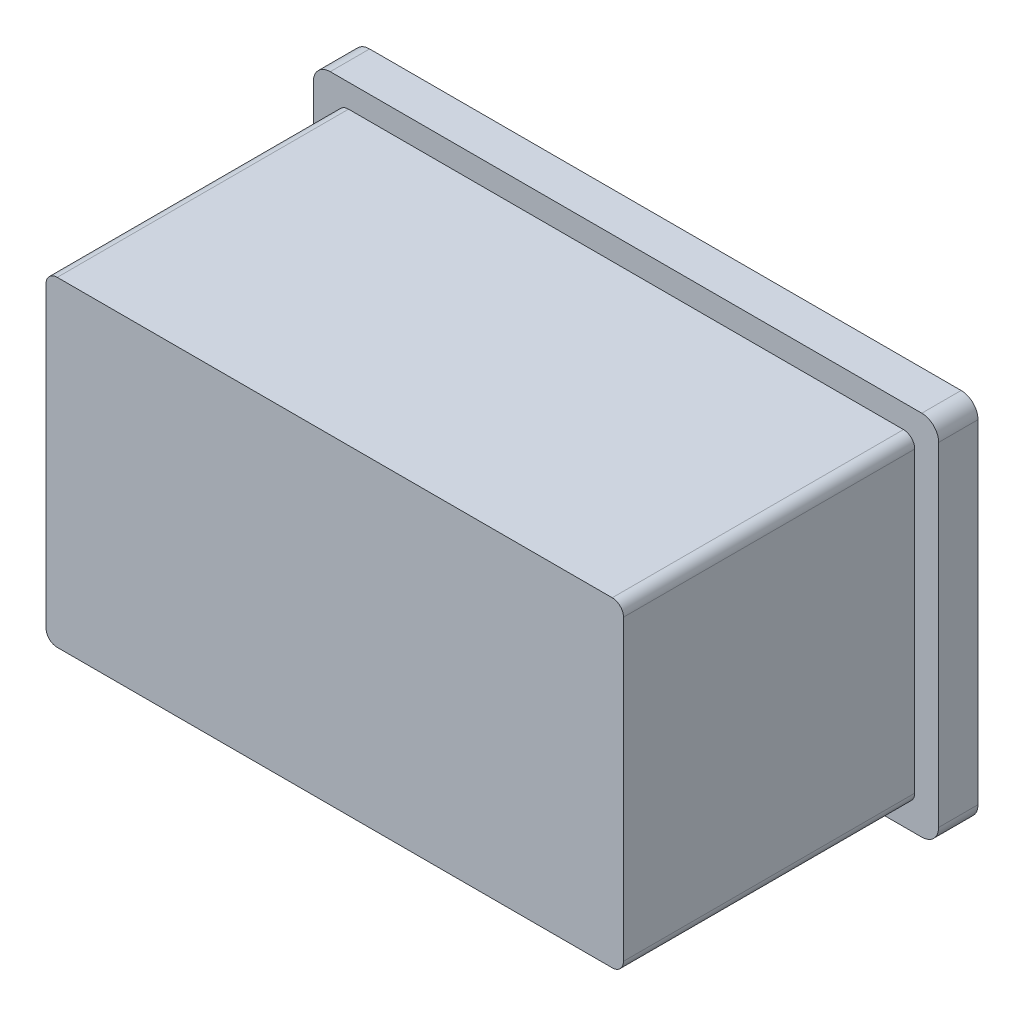
ISO-10303-21;
HEADER;
FILE_DESCRIPTION(('STEP AP214'),'2;1');
FILE_NAME('part.step','',(''),(''),'','','');
FILE_SCHEMA(('AUTOMOTIVE_DESIGN { 1 0 10303 214 1 1 1 1 }'));
ENDSEC;
DATA;
#1=APPLICATION_CONTEXT('core data for automotive mechanical design processes');
#2=APPLICATION_PROTOCOL_DEFINITION('international standard','automotive_design',2000,#1);
#3=PRODUCT_CONTEXT('',#1,'mechanical');
#4=PRODUCT('Part','Part','',(#3));
#5=PRODUCT_RELATED_PRODUCT_CATEGORY('part','',(#4));
#6=PRODUCT_DEFINITION_FORMATION('','',#4);
#7=PRODUCT_DEFINITION_CONTEXT('part definition',#1,'design');
#8=PRODUCT_DEFINITION('design','',#6,#7);
#9=PRODUCT_DEFINITION_SHAPE('','',#8);
#10=(LENGTH_UNIT() NAMED_UNIT(*) SI_UNIT(.MILLI.,.METRE.));
#11=(NAMED_UNIT(*) PLANE_ANGLE_UNIT() SI_UNIT($,.RADIAN.));
#12=(NAMED_UNIT(*) SI_UNIT($,.STERADIAN.) SOLID_ANGLE_UNIT());
#13=UNCERTAINTY_MEASURE_WITH_UNIT(LENGTH_MEASURE(1.E-05),#10,'distance_accuracy_value','');
#14=(GEOMETRIC_REPRESENTATION_CONTEXT(3) GLOBAL_UNCERTAINTY_ASSIGNED_CONTEXT((#13)) GLOBAL_UNIT_ASSIGNED_CONTEXT((#10,
#11,#12)) REPRESENTATION_CONTEXT('',''));
#15=CARTESIAN_POINT('',(0.,0.,0.));
#16=DIRECTION('',(0.,0.,1.));
#17=DIRECTION('',(1.,0.,0.));
#18=AXIS2_PLACEMENT_3D('',#15,#16,#17);
#19=CARTESIAN_POINT('',(34.15,10.15,58.8));
#20=DIRECTION('',(0.,0.,-1.));
#21=DIRECTION('',(-1.,0.,0.));
#22=AXIS2_PLACEMENT_3D('',#19,#20,#21);
#23=CYLINDRICAL_SURFACE('',#22,2.);
#24=CARTESIAN_POINT('',(34.15,10.15,7.));
#25=DIRECTION('',(0.,0.,1.));
#26=DIRECTION('',(1.,0.,0.));
#27=AXIS2_PLACEMENT_3D('',#24,#25,#26);
#28=CIRCLE('',#27,2.);
#29=CARTESIAN_POINT('',(32.15,10.15,7.));
#30=VERTEX_POINT('',#29);
#31=CARTESIAN_POINT('',(34.15,8.15,7.));
#32=VERTEX_POINT('',#31);
#33=EDGE_CURVE('E174',#30,#32,#28,.T.);
#34=ORIENTED_EDGE('',*,*,#33,.T.);
#35=DIRECTION('',(0.,0.,-1.));
#36=VECTOR('',#35,1.);
#37=CARTESIAN_POINT('',(34.15,8.15,58.8));
#38=LINE('',#37,#36);
#39=CARTESIAN_POINT('',(34.15,8.15,58.8));
#40=VERTEX_POINT('',#39);
#41=EDGE_CURVE('E11',#40,#32,#38,.T.);
#42=ORIENTED_EDGE('',*,*,#41,.F.);
#43=CARTESIAN_POINT('',(34.15,10.15,58.8));
#44=DIRECTION('',(0.,0.,1.));
#45=DIRECTION('',(1.,0.,0.));
#46=AXIS2_PLACEMENT_3D('',#43,#44,#45);
#47=CIRCLE('',#46,2.);
#48=CARTESIAN_POINT('',(32.15,10.15,58.8));
#49=VERTEX_POINT('',#48);
#50=EDGE_CURVE('E183',#49,#40,#47,.T.);
#51=ORIENTED_EDGE('',*,*,#50,.F.);
#52=DIRECTION('',(0.,0.,-1.));
#53=VECTOR('',#52,1.);
#54=CARTESIAN_POINT('',(32.15,10.15,58.8));
#55=LINE('',#54,#53);
#56=EDGE_CURVE('E198',#49,#30,#55,.T.);
#57=ORIENTED_EDGE('',*,*,#56,.T.);
#58=EDGE_LOOP('',(#34,#42,#51,#57));
#59=FACE_BOUND('',#58,.T.);
#60=ADVANCED_FACE('F41',(#59),#23,.T.);
#61=CARTESIAN_POINT('',(34.15,8.15,58.8));
#62=DIRECTION('',(0.,1.,0.));
#63=DIRECTION('',(0.,0.,1.));
#64=AXIS2_PLACEMENT_3D('',#61,#62,#63);
#65=PLANE('',#64);
#66=DIRECTION('',(1.,0.,0.));
#67=VECTOR('',#66,1.);
#68=CARTESIAN_POINT('',(34.15,8.15,7.));
#69=LINE('',#68,#67);
#70=CARTESIAN_POINT('',(132.85,8.15,7.));
#71=VERTEX_POINT('',#70);
#72=EDGE_CURVE('E178',#32,#71,#69,.T.);
#73=ORIENTED_EDGE('',*,*,#72,.T.);
#74=DIRECTION('',(0.,0.,-1.));
#75=VECTOR('',#74,1.);
#76=CARTESIAN_POINT('',(132.85,8.15,58.8));
#77=LINE('',#76,#75);
#78=CARTESIAN_POINT('',(132.85,8.15,58.8));
#79=VERTEX_POINT('',#78);
#80=EDGE_CURVE('E47',#79,#71,#77,.T.);
#81=ORIENTED_EDGE('',*,*,#80,.F.);
#82=DIRECTION('',(1.,0.,0.));
#83=VECTOR('',#82,1.);
#84=CARTESIAN_POINT('',(34.15,8.15,58.8));
#85=LINE('',#84,#83);
#86=EDGE_CURVE('E187',#40,#79,#85,.T.);
#87=ORIENTED_EDGE('',*,*,#86,.F.);
#88=ORIENTED_EDGE('',*,*,#41,.T.);
#89=EDGE_LOOP('',(#73,#81,#87,#88));
#90=FACE_BOUND('',#89,.T.);
#91=ADVANCED_FACE('F242',(#90),#65,.F.);
#92=CARTESIAN_POINT('',(132.85,10.15,58.8));
#93=DIRECTION('',(0.,0.,-1.));
#94=DIRECTION('',(-1.,0.,0.));
#95=AXIS2_PLACEMENT_3D('',#92,#93,#94);
#96=CYLINDRICAL_SURFACE('',#95,2.);
#97=CARTESIAN_POINT('',(132.85,10.15,7.));
#98=DIRECTION('',(0.,0.,1.));
#99=DIRECTION('',(1.,0.,0.));
#100=AXIS2_PLACEMENT_3D('',#97,#98,#99);
#101=CIRCLE('',#100,2.);
#102=CARTESIAN_POINT('',(134.85,10.15,7.));
#103=VERTEX_POINT('',#102);
#104=EDGE_CURVE('E201',#71,#103,#101,.T.);
#105=ORIENTED_EDGE('',*,*,#104,.T.);
#106=DIRECTION('',(0.,0.,-1.));
#107=VECTOR('',#106,1.);
#108=CARTESIAN_POINT('',(134.85,10.15,58.8));
#109=LINE('',#108,#107);
#110=CARTESIAN_POINT('',(134.85,10.15,58.8));
#111=VERTEX_POINT('',#110);
#112=EDGE_CURVE('E234',#111,#103,#109,.T.);
#113=ORIENTED_EDGE('',*,*,#112,.F.);
#114=CARTESIAN_POINT('',(132.85,10.15,58.8));
#115=DIRECTION('',(0.,0.,1.));
#116=DIRECTION('',(1.,0.,0.));
#117=AXIS2_PLACEMENT_3D('',#114,#115,#116);
#118=CIRCLE('',#117,2.);
#119=EDGE_CURVE('E186',#79,#111,#118,.T.);
#120=ORIENTED_EDGE('',*,*,#119,.F.);
#121=ORIENTED_EDGE('',*,*,#80,.T.);
#122=EDGE_LOOP('',(#105,#113,#120,#121));
#123=FACE_BOUND('',#122,.T.);
#124=ADVANCED_FACE('F239',(#123),#96,.T.);
#125=CARTESIAN_POINT('',(134.85,10.15,58.8));
#126=DIRECTION('',(-1.,0.,0.));
#127=DIRECTION('',(0.,0.,1.));
#128=AXIS2_PLACEMENT_3D('',#125,#126,#127);
#129=PLANE('',#128);
#130=DIRECTION('',(0.,1.,0.));
#131=VECTOR('',#130,1.);
#132=CARTESIAN_POINT('',(134.85,10.15,7.));
#133=LINE('',#132,#131);
#134=CARTESIAN_POINT('',(134.85,63.15,7.));
#135=VERTEX_POINT('',#134);
#136=EDGE_CURVE('E207',#103,#135,#133,.T.);
#137=ORIENTED_EDGE('',*,*,#136,.T.);
#138=DIRECTION('',(0.,0.,-1.));
#139=VECTOR('',#138,1.);
#140=CARTESIAN_POINT('',(134.85,63.15,58.8));
#141=LINE('',#140,#139);
#142=CARTESIAN_POINT('',(134.85,63.15,58.8));
#143=VERTEX_POINT('',#142);
#144=EDGE_CURVE('E233',#143,#135,#141,.T.);
#145=ORIENTED_EDGE('',*,*,#144,.F.);
#146=DIRECTION('',(0.,1.,0.));
#147=VECTOR('',#146,1.);
#148=CARTESIAN_POINT('',(134.85,10.15,58.8));
#149=LINE('',#148,#147);
#150=EDGE_CURVE('E193',#111,#143,#149,.T.);
#151=ORIENTED_EDGE('',*,*,#150,.F.);
#152=ORIENTED_EDGE('',*,*,#112,.T.);
#153=EDGE_LOOP('',(#137,#145,#151,#152));
#154=FACE_BOUND('',#153,.T.);
#155=ADVANCED_FACE('F247',(#154),#129,.F.);
#156=CARTESIAN_POINT('',(132.85,63.15,58.8));
#157=DIRECTION('',(0.,0.,-1.));
#158=DIRECTION('',(-1.,0.,0.));
#159=AXIS2_PLACEMENT_3D('',#156,#157,#158);
#160=CYLINDRICAL_SURFACE('',#159,1.99999999999999);
#161=CARTESIAN_POINT('',(132.85,63.15,7.));
#162=DIRECTION('',(0.,0.,1.));
#163=DIRECTION('',(1.,0.,0.));
#164=AXIS2_PLACEMENT_3D('',#161,#162,#163);
#165=CIRCLE('',#164,1.99999999999999);
#166=CARTESIAN_POINT('',(132.85,65.15,7.));
#167=VERTEX_POINT('',#166);
#168=EDGE_CURVE('E209',#135,#167,#165,.T.);
#169=ORIENTED_EDGE('',*,*,#168,.T.);
#170=DIRECTION('',(0.,0.,-1.));
#171=VECTOR('',#170,1.);
#172=CARTESIAN_POINT('',(132.85,65.15,58.8));
#173=LINE('',#172,#171);
#174=CARTESIAN_POINT('',(132.85,65.15,58.8));
#175=VERTEX_POINT('',#174);
#176=EDGE_CURVE('E226',#175,#167,#173,.T.);
#177=ORIENTED_EDGE('',*,*,#176,.F.);
#178=CARTESIAN_POINT('',(132.85,63.15,58.8));
#179=DIRECTION('',(0.,0.,1.));
#180=DIRECTION('',(1.,0.,0.));
#181=AXIS2_PLACEMENT_3D('',#178,#179,#180);
#182=CIRCLE('',#181,1.99999999999999);
#183=EDGE_CURVE('E192',#143,#175,#182,.T.);
#184=ORIENTED_EDGE('',*,*,#183,.F.);
#185=ORIENTED_EDGE('',*,*,#144,.T.);
#186=EDGE_LOOP('',(#169,#177,#184,#185));
#187=FACE_BOUND('',#186,.T.);
#188=ADVANCED_FACE('F255',(#187),#160,.T.);
#189=CARTESIAN_POINT('',(132.85,65.15,58.8));
#190=DIRECTION('',(0.,-1.,0.));
#191=DIRECTION('',(0.,0.,-1.));
#192=AXIS2_PLACEMENT_3D('',#189,#190,#191);
#193=PLANE('',#192);
#194=DIRECTION('',(-1.,0.,0.));
#195=VECTOR('',#194,1.);
#196=CARTESIAN_POINT('',(132.85,65.15,7.));
#197=LINE('',#196,#195);
#198=CARTESIAN_POINT('',(34.15,65.15,7.));
#199=VERTEX_POINT('',#198);
#200=EDGE_CURVE('E214',#167,#199,#197,.T.);
#201=ORIENTED_EDGE('',*,*,#200,.T.);
#202=DIRECTION('',(0.,0.,-1.));
#203=VECTOR('',#202,1.);
#204=CARTESIAN_POINT('',(34.15,65.15,58.8));
#205=LINE('',#204,#203);
#206=CARTESIAN_POINT('',(34.15,65.15,58.8));
#207=VERTEX_POINT('',#206);
#208=EDGE_CURVE('E224',#207,#199,#205,.T.);
#209=ORIENTED_EDGE('',*,*,#208,.F.);
#210=DIRECTION('',(-1.,0.,0.));
#211=VECTOR('',#210,1.);
#212=CARTESIAN_POINT('',(132.85,65.15,58.8));
#213=LINE('',#212,#211);
#214=EDGE_CURVE('E191',#175,#207,#213,.T.);
#215=ORIENTED_EDGE('',*,*,#214,.F.);
#216=ORIENTED_EDGE('',*,*,#176,.T.);
#217=EDGE_LOOP('',(#201,#209,#215,#216));
#218=FACE_BOUND('',#217,.T.);
#219=ADVANCED_FACE('F268',(#218),#193,.F.);
#220=CARTESIAN_POINT('',(34.15,63.15,58.8));
#221=DIRECTION('',(0.,0.,-1.));
#222=DIRECTION('',(-1.,0.,0.));
#223=AXIS2_PLACEMENT_3D('',#220,#221,#222);
#224=CYLINDRICAL_SURFACE('',#223,1.99999999999999);
#225=CARTESIAN_POINT('',(34.15,63.15,7.));
#226=DIRECTION('',(0.,0.,1.));
#227=DIRECTION('',(1.,0.,0.));
#228=AXIS2_PLACEMENT_3D('',#225,#226,#227);
#229=CIRCLE('',#228,1.99999999999999);
#230=CARTESIAN_POINT('',(32.15,63.15,7.));
#231=VERTEX_POINT('',#230);
#232=EDGE_CURVE('E211',#199,#231,#229,.T.);
#233=ORIENTED_EDGE('',*,*,#232,.T.);
#234=DIRECTION('',(0.,0.,-1.));
#235=VECTOR('',#234,1.);
#236=CARTESIAN_POINT('',(32.15,63.15,58.8));
#237=LINE('',#236,#235);
#238=CARTESIAN_POINT('',(32.15,63.15,58.8));
#239=VERTEX_POINT('',#238);
#240=EDGE_CURVE('E225',#239,#231,#237,.T.);
#241=ORIENTED_EDGE('',*,*,#240,.F.);
#242=CARTESIAN_POINT('',(34.15,63.15,58.8));
#243=DIRECTION('',(0.,0.,1.));
#244=DIRECTION('',(1.,0.,0.));
#245=AXIS2_PLACEMENT_3D('',#242,#243,#244);
#246=CIRCLE('',#245,1.99999999999999);
#247=EDGE_CURVE('E197',#207,#239,#246,.T.);
#248=ORIENTED_EDGE('',*,*,#247,.F.);
#249=ORIENTED_EDGE('',*,*,#208,.T.);
#250=EDGE_LOOP('',(#233,#241,#248,#249));
#251=FACE_BOUND('',#250,.T.);
#252=ADVANCED_FACE('F264',(#251),#224,.T.);
#253=CARTESIAN_POINT('',(32.15,63.15,58.8));
#254=DIRECTION('',(1.,0.,0.));
#255=DIRECTION('',(0.,0.,-1.));
#256=AXIS2_PLACEMENT_3D('',#253,#254,#255);
#257=PLANE('',#256);
#258=DIRECTION('',(0.,-1.,0.));
#259=VECTOR('',#258,1.);
#260=CARTESIAN_POINT('',(32.15,63.15,7.));
#261=LINE('',#260,#259);
#262=EDGE_CURVE('E190',#231,#30,#261,.T.);
#263=ORIENTED_EDGE('',*,*,#262,.T.);
#264=ORIENTED_EDGE('',*,*,#56,.F.);
#265=DIRECTION('',(0.,-1.,0.));
#266=VECTOR('',#265,1.);
#267=CARTESIAN_POINT('',(32.15,63.15,58.8));
#268=LINE('',#267,#266);
#269=EDGE_CURVE('E57',#239,#49,#268,.T.);
#270=ORIENTED_EDGE('',*,*,#269,.F.);
#271=ORIENTED_EDGE('',*,*,#240,.T.);
#272=EDGE_LOOP('',(#263,#264,#270,#271));
#273=FACE_BOUND('',#272,.T.);
#274=ADVANCED_FACE('F256',(#273),#257,.F.);
#275=CARTESIAN_POINT('',(34.15,10.15,58.8));
#276=DIRECTION('',(0.,0.,1.));
#277=DIRECTION('',(1.,0.,0.));
#278=AXIS2_PLACEMENT_3D('',#275,#276,#277);
#279=PLANE('',#278);
#280=ORIENTED_EDGE('',*,*,#50,.T.);
#281=ORIENTED_EDGE('',*,*,#86,.T.);
#282=ORIENTED_EDGE('',*,*,#119,.T.);
#283=ORIENTED_EDGE('',*,*,#150,.T.);
#284=ORIENTED_EDGE('',*,*,#183,.T.);
#285=ORIENTED_EDGE('',*,*,#214,.T.);
#286=ORIENTED_EDGE('',*,*,#247,.T.);
#287=ORIENTED_EDGE('',*,*,#269,.T.);
#288=EDGE_LOOP('',(#280,#281,#282,#283,#284,#285,#286,#287));
#289=FACE_BOUND('',#288,.T.);
#290=ADVANCED_FACE('F253',(#289),#279,.T.);
#291=CARTESIAN_POINT('',(30.9,7.,7.));
#292=DIRECTION('',(0.,0.,1.));
#293=DIRECTION('',(1.,0.,0.));
#294=AXIS2_PLACEMENT_3D('',#291,#292,#293);
#295=PLANE('',#294);
#296=CARTESIAN_POINT('',(30.9,7.,7.));
#297=DIRECTION('',(0.,0.,1.));
#298=DIRECTION('',(1.,0.,0.));
#299=AXIS2_PLACEMENT_3D('',#296,#297,#298);
#300=CIRCLE('',#299,3.);
#301=CARTESIAN_POINT('',(27.9,7.,7.));
#302=VERTEX_POINT('',#301);
#303=CARTESIAN_POINT('',(30.9,4.,7.));
#304=VERTEX_POINT('',#303);
#305=EDGE_CURVE('E159',#302,#304,#300,.T.);
#306=ORIENTED_EDGE('',*,*,#305,.T.);
#307=DIRECTION('',(1.,0.,0.));
#308=VECTOR('',#307,1.);
#309=CARTESIAN_POINT('',(30.9,4.,7.));
#310=LINE('',#309,#308);
#311=CARTESIAN_POINT('',(136.1,4.,7.));
#312=VERTEX_POINT('',#311);
#313=EDGE_CURVE('E150',#304,#312,#310,.T.);
#314=ORIENTED_EDGE('',*,*,#313,.T.);
#315=CARTESIAN_POINT('',(136.1,7.,7.));
#316=DIRECTION('',(0.,0.,1.));
#317=DIRECTION('',(1.,0.,0.));
#318=AXIS2_PLACEMENT_3D('',#315,#316,#317);
#319=CIRCLE('',#318,3.);
#320=CARTESIAN_POINT('',(139.1,7.,7.));
#321=VERTEX_POINT('',#320);
#322=EDGE_CURVE('E157',#312,#321,#319,.T.);
#323=ORIENTED_EDGE('',*,*,#322,.T.);
#324=DIRECTION('',(0.,1.,0.));
#325=VECTOR('',#324,1.);
#326=CARTESIAN_POINT('',(139.1,7.,7.));
#327=LINE('',#326,#325);
#328=CARTESIAN_POINT('',(139.1,66.3,7.));
#329=VERTEX_POINT('',#328);
#330=EDGE_CURVE('E456',#321,#329,#327,.T.);
#331=ORIENTED_EDGE('',*,*,#330,.T.);
#332=CARTESIAN_POINT('',(136.1,66.3,7.));
#333=DIRECTION('',(0.,0.,1.));
#334=DIRECTION('',(1.,0.,0.));
#335=AXIS2_PLACEMENT_3D('',#332,#333,#334);
#336=CIRCLE('',#335,3.);
#337=CARTESIAN_POINT('',(136.1,69.3,7.));
#338=VERTEX_POINT('',#337);
#339=EDGE_CURVE('E467',#329,#338,#336,.T.);
#340=ORIENTED_EDGE('',*,*,#339,.T.);
#341=DIRECTION('',(-1.,0.,0.));
#342=VECTOR('',#341,1.);
#343=CARTESIAN_POINT('',(136.1,69.3,7.));
#344=LINE('',#343,#342);
#345=CARTESIAN_POINT('',(30.9,69.3,7.));
#346=VERTEX_POINT('',#345);
#347=EDGE_CURVE('E461',#338,#346,#344,.T.);
#348=ORIENTED_EDGE('',*,*,#347,.T.);
#349=CARTESIAN_POINT('',(30.9,66.3,7.));
#350=DIRECTION('',(0.,0.,1.));
#351=DIRECTION('',(1.,0.,0.));
#352=AXIS2_PLACEMENT_3D('',#349,#350,#351);
#353=CIRCLE('',#352,3.);
#354=CARTESIAN_POINT('',(27.9,66.3,7.));
#355=VERTEX_POINT('',#354);
#356=EDGE_CURVE('E464',#346,#355,#353,.T.);
#357=ORIENTED_EDGE('',*,*,#356,.T.);
#358=DIRECTION('',(0.,-1.,0.));
#359=VECTOR('',#358,1.);
#360=CARTESIAN_POINT('',(27.9,66.3,7.));
#361=LINE('',#360,#359);
#362=EDGE_CURVE('E168',#355,#302,#361,.T.);
#363=ORIENTED_EDGE('',*,*,#362,.T.);
#364=EDGE_LOOP('',(#306,#314,#323,#331,#340,#348,#357,#363));
#365=FACE_BOUND('',#364,.T.);
#366=ORIENTED_EDGE('',*,*,#33,.F.);
#367=ORIENTED_EDGE('',*,*,#262,.F.);
#368=ORIENTED_EDGE('',*,*,#232,.F.);
#369=ORIENTED_EDGE('',*,*,#200,.F.);
#370=ORIENTED_EDGE('',*,*,#168,.F.);
#371=ORIENTED_EDGE('',*,*,#136,.F.);
#372=ORIENTED_EDGE('',*,*,#104,.F.);
#373=ORIENTED_EDGE('',*,*,#72,.F.);
#374=EDGE_LOOP('',(#366,#367,#368,#369,#370,#371,#372,#373));
#375=FACE_BOUND('',#374,.T.);
#376=ADVANCED_FACE('F161',(#365,#375),#295,.T.);
#377=CARTESIAN_POINT('',(30.9,7.,7.));
#378=DIRECTION('',(0.,0.,-1.));
#379=DIRECTION('',(-1.,0.,0.));
#380=AXIS2_PLACEMENT_3D('',#377,#378,#379);
#381=CYLINDRICAL_SURFACE('',#380,3.);
#382=CARTESIAN_POINT('',(30.9,7.,0.));
#383=DIRECTION('',(0.,0.,1.));
#384=DIRECTION('',(1.,0.,0.));
#385=AXIS2_PLACEMENT_3D('',#382,#383,#384);
#386=CIRCLE('',#385,3.);
#387=CARTESIAN_POINT('',(27.9,7.,0.));
#388=VERTEX_POINT('',#387);
#389=CARTESIAN_POINT('',(30.9,4.,0.));
#390=VERTEX_POINT('',#389);
#391=EDGE_CURVE('E172',#388,#390,#386,.T.);
#392=ORIENTED_EDGE('',*,*,#391,.T.);
#393=DIRECTION('',(0.,0.,-1.));
#394=VECTOR('',#393,1.);
#395=CARTESIAN_POINT('',(30.9,4.,7.));
#396=LINE('',#395,#394);
#397=EDGE_CURVE('E154',#304,#390,#396,.T.);
#398=ORIENTED_EDGE('',*,*,#397,.F.);
#399=ORIENTED_EDGE('',*,*,#305,.F.);
#400=DIRECTION('',(0.,0.,-1.));
#401=VECTOR('',#400,1.);
#402=CARTESIAN_POINT('',(27.9,7.,7.));
#403=LINE('',#402,#401);
#404=EDGE_CURVE('E438',#302,#388,#403,.T.);
#405=ORIENTED_EDGE('',*,*,#404,.T.);
#406=EDGE_LOOP('',(#392,#398,#399,#405));
#407=FACE_BOUND('',#406,.T.);
#408=ADVANCED_FACE('F175',(#407),#381,.T.);
#409=CARTESIAN_POINT('',(30.9,4.,7.));
#410=DIRECTION('',(0.,1.,0.));
#411=DIRECTION('',(0.,0.,1.));
#412=AXIS2_PLACEMENT_3D('',#409,#410,#411);
#413=PLANE('',#412);
#414=DIRECTION('',(1.,0.,0.));
#415=VECTOR('',#414,1.);
#416=CARTESIAN_POINT('',(30.9,4.,0.));
#417=LINE('',#416,#415);
#418=CARTESIAN_POINT('',(136.1,4.,0.));
#419=VERTEX_POINT('',#418);
#420=EDGE_CURVE('E423',#390,#419,#417,.T.);
#421=ORIENTED_EDGE('',*,*,#420,.T.);
#422=DIRECTION('',(0.,0.,-1.));
#423=VECTOR('',#422,1.);
#424=CARTESIAN_POINT('',(136.1,4.,7.));
#425=LINE('',#424,#423);
#426=EDGE_CURVE('E158',#312,#419,#425,.T.);
#427=ORIENTED_EDGE('',*,*,#426,.F.);
#428=ORIENTED_EDGE('',*,*,#313,.F.);
#429=ORIENTED_EDGE('',*,*,#397,.T.);
#430=EDGE_LOOP('',(#421,#427,#428,#429));
#431=FACE_BOUND('',#430,.T.);
#432=ADVANCED_FACE('F151',(#431),#413,.F.);
#433=CARTESIAN_POINT('',(136.1,7.,7.));
#434=DIRECTION('',(0.,0.,-1.));
#435=DIRECTION('',(-1.,0.,0.));
#436=AXIS2_PLACEMENT_3D('',#433,#434,#435);
#437=CYLINDRICAL_SURFACE('',#436,3.);
#438=CARTESIAN_POINT('',(136.1,7.,0.));
#439=DIRECTION('',(0.,0.,1.));
#440=DIRECTION('',(1.,0.,0.));
#441=AXIS2_PLACEMENT_3D('',#438,#439,#440);
#442=CIRCLE('',#441,3.);
#443=CARTESIAN_POINT('',(139.1,7.,0.));
#444=VERTEX_POINT('',#443);
#445=EDGE_CURVE('E421',#419,#444,#442,.T.);
#446=ORIENTED_EDGE('',*,*,#445,.T.);
#447=DIRECTION('',(0.,0.,-1.));
#448=VECTOR('',#447,1.);
#449=CARTESIAN_POINT('',(139.1,7.,7.));
#450=LINE('',#449,#448);
#451=EDGE_CURVE('E179',#321,#444,#450,.T.);
#452=ORIENTED_EDGE('',*,*,#451,.F.);
#453=ORIENTED_EDGE('',*,*,#322,.F.);
#454=ORIENTED_EDGE('',*,*,#426,.T.);
#455=EDGE_LOOP('',(#446,#452,#453,#454));
#456=FACE_BOUND('',#455,.T.);
#457=ADVANCED_FACE('F346',(#456),#437,.T.);
#458=CARTESIAN_POINT('',(139.1,7.,7.));
#459=DIRECTION('',(-1.,0.,0.));
#460=DIRECTION('',(0.,0.,1.));
#461=AXIS2_PLACEMENT_3D('',#458,#459,#460);
#462=PLANE('',#461);
#463=DIRECTION('',(0.,1.,0.));
#464=VECTOR('',#463,1.);
#465=CARTESIAN_POINT('',(139.1,7.,0.));
#466=LINE('',#465,#464);
#467=CARTESIAN_POINT('',(139.1,66.3,0.));
#468=VERTEX_POINT('',#467);
#469=EDGE_CURVE('E429',#444,#468,#466,.T.);
#470=ORIENTED_EDGE('',*,*,#469,.T.);
#471=DIRECTION('',(0.,0.,-1.));
#472=VECTOR('',#471,1.);
#473=CARTESIAN_POINT('',(139.1,66.3,7.));
#474=LINE('',#473,#472);
#475=EDGE_CURVE('E446',#329,#468,#474,.T.);
#476=ORIENTED_EDGE('',*,*,#475,.F.);
#477=ORIENTED_EDGE('',*,*,#330,.F.);
#478=ORIENTED_EDGE('',*,*,#451,.T.);
#479=EDGE_LOOP('',(#470,#476,#477,#478));
#480=FACE_BOUND('',#479,.T.);
#481=ADVANCED_FACE('F354',(#480),#462,.F.);
#482=CARTESIAN_POINT('',(136.1,66.3,7.));
#483=DIRECTION('',(0.,0.,-1.));
#484=DIRECTION('',(-1.,0.,0.));
#485=AXIS2_PLACEMENT_3D('',#482,#483,#484);
#486=CYLINDRICAL_SURFACE('',#485,3.);
#487=CARTESIAN_POINT('',(136.1,66.3,0.));
#488=DIRECTION('',(0.,0.,1.));
#489=DIRECTION('',(1.,0.,0.));
#490=AXIS2_PLACEMENT_3D('',#487,#488,#489);
#491=CIRCLE('',#490,3.);
#492=CARTESIAN_POINT('',(136.1,69.3,0.));
#493=VERTEX_POINT('',#492);
#494=EDGE_CURVE('E431',#468,#493,#491,.T.);
#495=ORIENTED_EDGE('',*,*,#494,.T.);
#496=DIRECTION('',(0.,0.,-1.));
#497=VECTOR('',#496,1.);
#498=CARTESIAN_POINT('',(136.1,69.3,7.));
#499=LINE('',#498,#497);
#500=EDGE_CURVE('E447',#338,#493,#499,.T.);
#501=ORIENTED_EDGE('',*,*,#500,.F.);
#502=ORIENTED_EDGE('',*,*,#339,.F.);
#503=ORIENTED_EDGE('',*,*,#475,.T.);
#504=EDGE_LOOP('',(#495,#501,#502,#503));
#505=FACE_BOUND('',#504,.T.);
#506=ADVANCED_FACE('F362',(#505),#486,.T.);
#507=CARTESIAN_POINT('',(136.1,69.3,7.));
#508=DIRECTION('',(0.,-1.,0.));
#509=DIRECTION('',(0.,0.,-1.));
#510=AXIS2_PLACEMENT_3D('',#507,#508,#509);
#511=PLANE('',#510);
#512=DIRECTION('',(-1.,0.,0.));
#513=VECTOR('',#512,1.);
#514=CARTESIAN_POINT('',(136.1,69.3,0.));
#515=LINE('',#514,#513);
#516=CARTESIAN_POINT('',(30.9,69.3,0.));
#517=VERTEX_POINT('',#516);
#518=EDGE_CURVE('E433',#493,#517,#515,.T.);
#519=ORIENTED_EDGE('',*,*,#518,.T.);
#520=DIRECTION('',(0.,0.,-1.));
#521=VECTOR('',#520,1.);
#522=CARTESIAN_POINT('',(30.9,69.3,7.));
#523=LINE('',#522,#521);
#524=EDGE_CURVE('E442',#346,#517,#523,.T.);
#525=ORIENTED_EDGE('',*,*,#524,.F.);
#526=ORIENTED_EDGE('',*,*,#347,.F.);
#527=ORIENTED_EDGE('',*,*,#500,.T.);
#528=EDGE_LOOP('',(#519,#525,#526,#527));
#529=FACE_BOUND('',#528,.T.);
#530=ADVANCED_FACE('F374',(#529),#511,.F.);
#531=CARTESIAN_POINT('',(30.9,66.3,7.));
#532=DIRECTION('',(0.,0.,-1.));
#533=DIRECTION('',(-1.,0.,0.));
#534=AXIS2_PLACEMENT_3D('',#531,#532,#533);
#535=CYLINDRICAL_SURFACE('',#534,3.);
#536=CARTESIAN_POINT('',(30.9,66.3,0.));
#537=DIRECTION('',(0.,0.,1.));
#538=DIRECTION('',(1.,0.,0.));
#539=AXIS2_PLACEMENT_3D('',#536,#537,#538);
#540=CIRCLE('',#539,3.);
#541=CARTESIAN_POINT('',(27.9,66.3,0.));
#542=VERTEX_POINT('',#541);
#543=EDGE_CURVE('E434',#517,#542,#540,.T.);
#544=ORIENTED_EDGE('',*,*,#543,.T.);
#545=DIRECTION('',(0.,0.,-1.));
#546=VECTOR('',#545,1.);
#547=CARTESIAN_POINT('',(27.9,66.3,7.));
#548=LINE('',#547,#546);
#549=EDGE_CURVE('E439',#355,#542,#548,.T.);
#550=ORIENTED_EDGE('',*,*,#549,.F.);
#551=ORIENTED_EDGE('',*,*,#356,.F.);
#552=ORIENTED_EDGE('',*,*,#524,.T.);
#553=EDGE_LOOP('',(#544,#550,#551,#552));
#554=FACE_BOUND('',#553,.T.);
#555=ADVANCED_FACE('F383',(#554),#535,.T.);
#556=CARTESIAN_POINT('',(27.9,66.3,7.));
#557=DIRECTION('',(1.,0.,0.));
#558=DIRECTION('',(0.,0.,-1.));
#559=AXIS2_PLACEMENT_3D('',#556,#557,#558);
#560=PLANE('',#559);
#561=DIRECTION('',(0.,-1.,0.));
#562=VECTOR('',#561,1.);
#563=CARTESIAN_POINT('',(27.9,66.3,0.));
#564=LINE('',#563,#562);
#565=EDGE_CURVE('E167',#542,#388,#564,.T.);
#566=ORIENTED_EDGE('',*,*,#565,.T.);
#567=ORIENTED_EDGE('',*,*,#404,.F.);
#568=ORIENTED_EDGE('',*,*,#362,.F.);
#569=ORIENTED_EDGE('',*,*,#549,.T.);
#570=EDGE_LOOP('',(#566,#567,#568,#569));
#571=FACE_BOUND('',#570,.T.);
#572=ADVANCED_FACE('F395',(#571),#560,.F.);
#573=CARTESIAN_POINT('',(30.9,7.,0.));
#574=DIRECTION('',(0.,0.,1.));
#575=DIRECTION('',(1.,0.,0.));
#576=AXIS2_PLACEMENT_3D('',#573,#574,#575);
#577=PLANE('',#576);
#578=ORIENTED_EDGE('',*,*,#391,.F.);
#579=ORIENTED_EDGE('',*,*,#565,.F.);
#580=ORIENTED_EDGE('',*,*,#543,.F.);
#581=ORIENTED_EDGE('',*,*,#518,.F.);
#582=ORIENTED_EDGE('',*,*,#494,.F.);
#583=ORIENTED_EDGE('',*,*,#469,.F.);
#584=ORIENTED_EDGE('',*,*,#445,.F.);
#585=ORIENTED_EDGE('',*,*,#420,.F.);
#586=EDGE_LOOP('',(#578,#579,#580,#581,#582,#583,#584,#585));
#587=FACE_BOUND('',#586,.T.);
#588=ADVANCED_FACE('F403',(#587),#577,.F.);
#589=CLOSED_SHELL('',(#60,#91,#124,#155,#188,#219,#252,#274,#290,#376,#408,#432,#457,#481,#506,
#530,#555,#572,#588));
#590=MANIFOLD_SOLID_BREP('B2',#589);
#591=ADVANCED_BREP_SHAPE_REPRESENTATION('',(#18,#590),#14);
#592=SHAPE_DEFINITION_REPRESENTATION(#9,#591);
ENDSEC;
END-ISO-10303-21;
